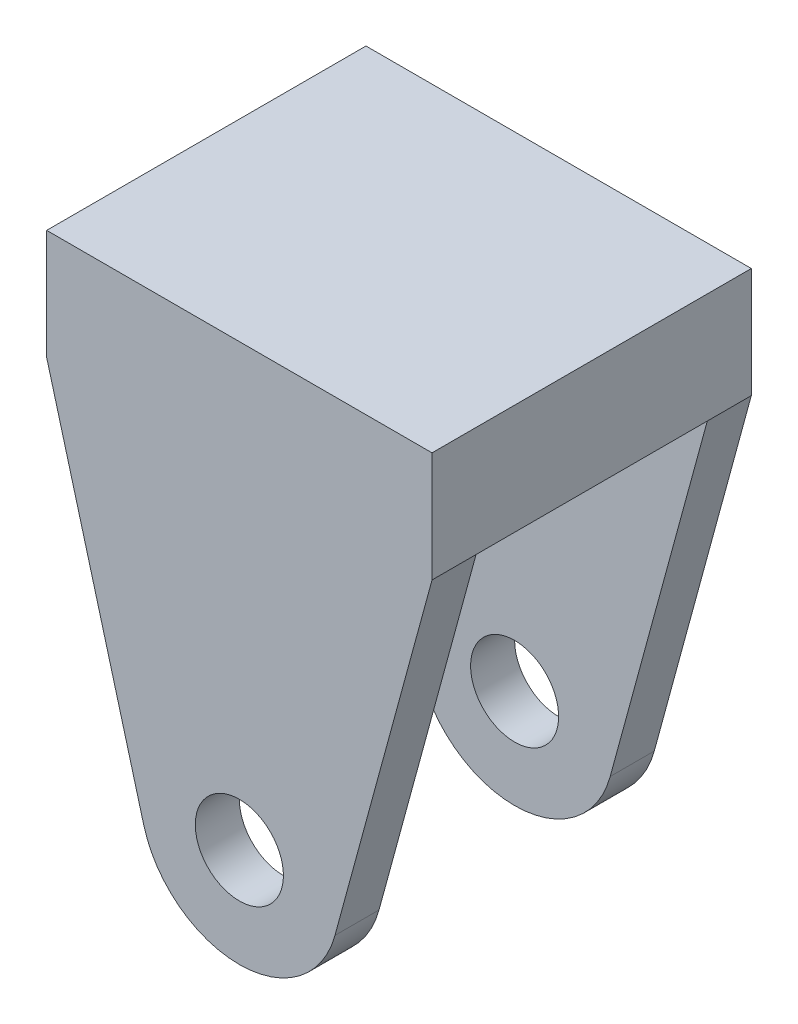
ISO-10303-21;
HEADER;
FILE_DESCRIPTION(('STEP AP214'),'2;1');
FILE_NAME('part.step','',(''),(''),'','','');
FILE_SCHEMA(('AUTOMOTIVE_DESIGN { 1 0 10303 214 1 1 1 1 }'));
ENDSEC;
DATA;
#1=APPLICATION_CONTEXT('core data for automotive mechanical design processes');
#2=APPLICATION_PROTOCOL_DEFINITION('international standard','automotive_design',2000,#1);
#3=PRODUCT_CONTEXT('',#1,'mechanical');
#4=PRODUCT('Part','Part','',(#3));
#5=PRODUCT_RELATED_PRODUCT_CATEGORY('part','',(#4));
#6=PRODUCT_DEFINITION_FORMATION('','',#4);
#7=PRODUCT_DEFINITION_CONTEXT('part definition',#1,'design');
#8=PRODUCT_DEFINITION('design','',#6,#7);
#9=PRODUCT_DEFINITION_SHAPE('','',#8);
#10=(LENGTH_UNIT() NAMED_UNIT(*) SI_UNIT(.MILLI.,.METRE.));
#11=(NAMED_UNIT(*) PLANE_ANGLE_UNIT() SI_UNIT($,.RADIAN.));
#12=(NAMED_UNIT(*) SI_UNIT($,.STERADIAN.) SOLID_ANGLE_UNIT());
#13=UNCERTAINTY_MEASURE_WITH_UNIT(LENGTH_MEASURE(1.E-05),#10,'distance_accuracy_value','');
#14=(GEOMETRIC_REPRESENTATION_CONTEXT(3) GLOBAL_UNCERTAINTY_ASSIGNED_CONTEXT((#13)) GLOBAL_UNIT_ASSIGNED_CONTEXT((#10,
#11,#12)) REPRESENTATION_CONTEXT('',''));
#15=CARTESIAN_POINT('',(0.,0.,0.));
#16=DIRECTION('',(0.,0.,1.));
#17=DIRECTION('',(1.,0.,0.));
#18=AXIS2_PLACEMENT_3D('',#15,#16,#17);
#19=CARTESIAN_POINT('',(-35.,60.,29.));
#20=DIRECTION('',(0.964843815735854,0.262823916788935,0.));
#21=DIRECTION('',(-0.262823916788935,0.964843815735854,0.));
#22=AXIS2_PLACEMENT_3D('',#19,#20,#21);
#23=PLANE('',#22);
#24=DIRECTION('',(0.262823916788935,-0.964843815735854,0.));
#25=VECTOR('',#24,1.);
#26=CARTESIAN_POINT('',(-17.3672837622536,-4.73085640176813,-21.));
#27=LINE('',#26,#25);
#28=CARTESIAN_POINT('',(-35.,60.,-21.));
#29=VERTEX_POINT('',#28);
#30=CARTESIAN_POINT('',(-17.3672837622536,-4.73085640176812,-21.));
#31=VERTEX_POINT('',#30);
#32=EDGE_CURVE('E208',#29,#31,#27,.T.);
#33=ORIENTED_EDGE('',*,*,#32,.F.);
#34=DIRECTION('',(0.,0.,-1.));
#35=VECTOR('',#34,1.);
#36=CARTESIAN_POINT('',(-35.,60.,29.));
#37=LINE('',#36,#35);
#38=CARTESIAN_POINT('',(-35.,60.,-29.));
#39=VERTEX_POINT('',#38);
#40=EDGE_CURVE('E42',#29,#39,#37,.T.);
#41=ORIENTED_EDGE('',*,*,#40,.T.);
#42=DIRECTION('',(0.262823916788935,-0.964843815735854,0.));
#43=VECTOR('',#42,1.);
#44=CARTESIAN_POINT('',(-35.,60.,-29.));
#45=LINE('',#44,#43);
#46=CARTESIAN_POINT('',(-17.3672837622536,-4.73085640176813,-29.));
#47=VERTEX_POINT('',#46);
#48=EDGE_CURVE('E139',#39,#47,#45,.T.);
#49=ORIENTED_EDGE('',*,*,#48,.T.);
#50=DIRECTION('',(0.,0.,-1.));
#51=VECTOR('',#50,1.);
#52=CARTESIAN_POINT('',(-17.3672837622536,-4.73085640176813,29.));
#53=LINE('',#52,#51);
#54=EDGE_CURVE('E157',#31,#47,#53,.T.);
#55=ORIENTED_EDGE('',*,*,#54,.F.);
#56=EDGE_LOOP('',(#33,#41,#49,#55));
#57=FACE_BOUND('',#56,.T.);
#58=ADVANCED_FACE('F33',(#57),#23,.F.);
#59=CARTESIAN_POINT('',(0.,0.,29.));
#60=DIRECTION('',(0.,0.,-1.));
#61=DIRECTION('',(-1.,0.,0.));
#62=AXIS2_PLACEMENT_3D('',#59,#60,#61);
#63=CYLINDRICAL_SURFACE('',#62,18.0000985434188);
#64=CARTESIAN_POINT('',(0.,0.,-21.));
#65=DIRECTION('',(0.,0.,1.));
#66=DIRECTION('',(1.,0.,0.));
#67=AXIS2_PLACEMENT_3D('',#64,#65,#66);
#68=CIRCLE('',#67,18.0000985434188);
#69=CARTESIAN_POINT('',(17.3672837622536,-4.73085640176813,-21.));
#70=VERTEX_POINT('',#69);
#71=EDGE_CURVE('E214',#31,#70,#68,.T.);
#72=ORIENTED_EDGE('',*,*,#71,.F.);
#73=ORIENTED_EDGE('',*,*,#54,.T.);
#74=CARTESIAN_POINT('',(0.,0.,-29.));
#75=DIRECTION('',(0.,0.,1.));
#76=DIRECTION('',(1.,0.,0.));
#77=AXIS2_PLACEMENT_3D('',#74,#75,#76);
#78=CIRCLE('',#77,18.0000985434188);
#79=CARTESIAN_POINT('',(17.3672837622536,-4.73085640176813,-29.));
#80=VERTEX_POINT('',#79);
#81=EDGE_CURVE('E143',#47,#80,#78,.T.);
#82=ORIENTED_EDGE('',*,*,#81,.T.);
#83=DIRECTION('',(0.,0.,-1.));
#84=VECTOR('',#83,1.);
#85=CARTESIAN_POINT('',(17.3672837622536,-4.73085640176813,29.));
#86=LINE('',#85,#84);
#87=EDGE_CURVE('E126',#70,#80,#86,.T.);
#88=ORIENTED_EDGE('',*,*,#87,.F.);
#89=EDGE_LOOP('',(#72,#73,#82,#88));
#90=FACE_BOUND('',#89,.T.);
#91=ADVANCED_FACE('F229',(#90),#63,.T.);
#92=CARTESIAN_POINT('',(35.,60.,29.));
#93=DIRECTION('',(-0.964843815735854,0.262823916788935,0.));
#94=DIRECTION('',(-0.262823916788935,-0.964843815735854,0.));
#95=AXIS2_PLACEMENT_3D('',#92,#93,#94);
#96=PLANE('',#95);
#97=DIRECTION('',(0.262823916788935,0.964843815735854,0.));
#98=VECTOR('',#97,1.);
#99=CARTESIAN_POINT('',(35.,60.,-21.));
#100=LINE('',#99,#98);
#101=CARTESIAN_POINT('',(35.,60.,-21.));
#102=VERTEX_POINT('',#101);
#103=EDGE_CURVE('E219',#70,#102,#100,.T.);
#104=ORIENTED_EDGE('',*,*,#103,.F.);
#105=ORIENTED_EDGE('',*,*,#87,.T.);
#106=DIRECTION('',(0.262823916788935,0.964843815735854,0.));
#107=VECTOR('',#106,1.);
#108=CARTESIAN_POINT('',(35.,60.,-29.));
#109=LINE('',#108,#107);
#110=CARTESIAN_POINT('',(35.,60.,-29.));
#111=VERTEX_POINT('',#110);
#112=EDGE_CURVE('E146',#80,#111,#109,.T.);
#113=ORIENTED_EDGE('',*,*,#112,.T.);
#114=DIRECTION('',(0.,0.,-1.));
#115=VECTOR('',#114,1.);
#116=CARTESIAN_POINT('',(35.,60.,29.));
#117=LINE('',#116,#115);
#118=EDGE_CURVE('E127',#102,#111,#117,.T.);
#119=ORIENTED_EDGE('',*,*,#118,.F.);
#120=EDGE_LOOP('',(#104,#105,#113,#119));
#121=FACE_BOUND('',#120,.T.);
#122=ADVANCED_FACE('F228',(#121),#96,.F.);
#123=CARTESIAN_POINT('',(0.,0.,29.));
#124=DIRECTION('',(0.,0.,-1.));
#125=DIRECTION('',(-1.,0.,0.));
#126=AXIS2_PLACEMENT_3D('',#123,#124,#125);
#127=CYLINDRICAL_SURFACE('',#126,8.);
#128=CARTESIAN_POINT('',(0.,0.,-29.));
#129=DIRECTION('',(0.,0.,1.));
#130=DIRECTION('',(1.,0.,0.));
#131=AXIS2_PLACEMENT_3D('',#128,#129,#130);
#132=CIRCLE('',#131,8.);
#133=CARTESIAN_POINT('',(-8.,0.,-29.));
#134=VERTEX_POINT('',#133);
#135=EDGE_CURVE('E166',#134,#134,#132,.T.);
#136=CARTESIAN_POINT('',(0.,0.,-21.));
#137=DIRECTION('',(0.,0.,1.));
#138=DIRECTION('',(1.,0.,0.));
#139=AXIS2_PLACEMENT_3D('',#136,#137,#138);
#140=CIRCLE('',#139,8.);
#141=CARTESIAN_POINT('',(-8.,0.,-21.));
#142=VERTEX_POINT('',#141);
#143=EDGE_CURVE('E37',#142,#142,#140,.T.);
#144=CARTESIAN_POINT('',(-8.,0.,-29.));
#145=CARTESIAN_POINT('',(-8.,0.,-28.9166666666667));
#146=CARTESIAN_POINT('',(-8.,0.,-28.8333333333333));
#147=CARTESIAN_POINT('',(-8.,0.,-28.6666666666667));
#148=CARTESIAN_POINT('',(-8.,0.,-28.5833333333333));
#149=CARTESIAN_POINT('',(-8.,0.,-28.4166666666667));
#150=CARTESIAN_POINT('',(-8.,0.,-28.3333333333333));
#151=CARTESIAN_POINT('',(-8.,0.,-28.1666666666667));
#152=CARTESIAN_POINT('',(-8.,0.,-28.0833333333333));
#153=CARTESIAN_POINT('',(-8.,0.,-27.9166666666667));
#154=CARTESIAN_POINT('',(-8.,0.,-27.8333333333333));
#155=CARTESIAN_POINT('',(-8.,0.,-27.6666666666667));
#156=CARTESIAN_POINT('',(-8.,0.,-27.5833333333333));
#157=CARTESIAN_POINT('',(-8.,0.,-27.4166666666667));
#158=CARTESIAN_POINT('',(-8.,0.,-27.3333333333333));
#159=CARTESIAN_POINT('',(-8.,0.,-27.1666666666667));
#160=CARTESIAN_POINT('',(-8.,0.,-27.0833333333333));
#161=CARTESIAN_POINT('',(-8.,0.,-26.9166666666667));
#162=CARTESIAN_POINT('',(-8.,0.,-26.8333333333333));
#163=CARTESIAN_POINT('',(-8.,0.,-26.6666666666667));
#164=CARTESIAN_POINT('',(-8.,0.,-26.5833333333333));
#165=CARTESIAN_POINT('',(-8.,0.,-26.4166666666667));
#166=CARTESIAN_POINT('',(-8.,0.,-26.3333333333333));
#167=CARTESIAN_POINT('',(-8.,0.,-26.1666666666667));
#168=CARTESIAN_POINT('',(-8.,0.,-26.0833333333333));
#169=CARTESIAN_POINT('',(-8.,0.,-25.9166666666667));
#170=CARTESIAN_POINT('',(-8.,0.,-25.8333333333333));
#171=CARTESIAN_POINT('',(-8.,0.,-25.6666666666667));
#172=CARTESIAN_POINT('',(-8.,0.,-25.5833333333333));
#173=CARTESIAN_POINT('',(-8.,0.,-25.4166666666667));
#174=CARTESIAN_POINT('',(-8.,0.,-25.3333333333333));
#175=CARTESIAN_POINT('',(-8.,0.,-25.1666666666667));
#176=CARTESIAN_POINT('',(-8.,0.,-25.0833333333333));
#177=CARTESIAN_POINT('',(-8.,0.,-24.9166666666667));
#178=CARTESIAN_POINT('',(-8.,0.,-24.8333333333333));
#179=CARTESIAN_POINT('',(-8.,0.,-24.6666666666667));
#180=CARTESIAN_POINT('',(-8.,0.,-24.5833333333333));
#181=CARTESIAN_POINT('',(-8.,0.,-24.4166666666667));
#182=CARTESIAN_POINT('',(-8.,0.,-24.3333333333333));
#183=CARTESIAN_POINT('',(-8.,0.,-24.1666666666667));
#184=CARTESIAN_POINT('',(-8.,0.,-24.0833333333333));
#185=CARTESIAN_POINT('',(-8.,0.,-23.9166666666667));
#186=CARTESIAN_POINT('',(-8.,0.,-23.8333333333333));
#187=CARTESIAN_POINT('',(-8.,0.,-23.6666666666667));
#188=CARTESIAN_POINT('',(-8.,0.,-23.5833333333333));
#189=CARTESIAN_POINT('',(-8.,0.,-23.4166666666667));
#190=CARTESIAN_POINT('',(-8.,0.,-23.3333333333333));
#191=CARTESIAN_POINT('',(-8.,0.,-23.1666666666667));
#192=CARTESIAN_POINT('',(-8.,0.,-23.0833333333333));
#193=CARTESIAN_POINT('',(-8.,0.,-22.9166666666667));
#194=CARTESIAN_POINT('',(-8.,0.,-22.8333333333333));
#195=CARTESIAN_POINT('',(-8.,0.,-22.6666666666667));
#196=CARTESIAN_POINT('',(-8.,0.,-22.5833333333333));
#197=CARTESIAN_POINT('',(-8.,0.,-22.4166666666667));
#198=CARTESIAN_POINT('',(-8.,0.,-22.3333333333333));
#199=CARTESIAN_POINT('',(-8.,0.,-22.1666666666667));
#200=CARTESIAN_POINT('',(-8.,0.,-22.0833333333333));
#201=CARTESIAN_POINT('',(-8.,0.,-21.9166666666667));
#202=CARTESIAN_POINT('',(-8.,0.,-21.8333333333333));
#203=CARTESIAN_POINT('',(-8.,0.,-21.6666666666667));
#204=CARTESIAN_POINT('',(-8.,0.,-21.5833333333333));
#205=CARTESIAN_POINT('',(-8.,0.,-21.4166666666667));
#206=CARTESIAN_POINT('',(-8.,0.,-21.3333333333333));
#207=CARTESIAN_POINT('',(-8.,0.,-21.1666666666667));
#208=CARTESIAN_POINT('',(-8.,0.,-21.0833333333333));
#209=CARTESIAN_POINT('',(-8.,0.,-21.));
#210=B_SPLINE_CURVE_WITH_KNOTS('',3,(#144,#145,#146,#147,#148,#149,#150,#151,#152,#153,#154,
#155,#156,#157,#158,#159,#160,#161,#162,#163,#164,#165,#166,#167,#168,#169,#170,#171,#172,#173,
#174,#175,#176,#177,#178,#179,#180,#181,#182,#183,#184,#185,#186,#187,#188,#189,#190,#191,#192,
#193,#194,#195,#196,#197,#198,#199,#200,#201,#202,#203,#204,#205,#206,#207,#208,#209),
.UNSPECIFIED.,.F.,.F.,(4,2,2,2,2,2,2,2,2,2,2,2,2,2,2,2,2,2,2,2,2,2,2,2,2,2,2,2,2,2,2,2,4),(0.,
0.25,0.5,0.750000000000001,1.,1.25,1.5,1.75,2.,2.25,2.5,2.75,3.,3.25,3.5,3.75,4.,4.25,4.5,4.75,
5.,5.25,5.5,5.74999999999999,5.99999999999999,6.24999999999999,6.49999999999999,
6.74999999999999,6.99999999999999,7.24999999999999,7.49999999999999,7.74999999999999,
7.99999999999999),.UNSPECIFIED.);
#211=EDGE_CURVE('BSEAM262',#134,#142,#210,.T.);
#212=ORIENTED_EDGE('',*,*,#135,.F.);
#213=ORIENTED_EDGE('',*,*,#143,.T.);
#214=ORIENTED_EDGE('',*,*,#211,.T.);
#215=ORIENTED_EDGE('',*,*,#211,.F.);
#216=EDGE_LOOP('',(#212,#214,#213,#215));
#217=FACE_BOUND('',#216,.T.);
#218=ADVANCED_FACE('F262',(#217),#127,.F.);
#219=CARTESIAN_POINT('',(0.,0.,29.));
#220=DIRECTION('',(0.,0.,1.));
#221=DIRECTION('',(1.,0.,0.));
#222=AXIS2_PLACEMENT_3D('',#219,#220,#221);
#223=PLANE('',#222);
#224=DIRECTION('',(0.,-1.,0.));
#225=VECTOR('',#224,1.);
#226=CARTESIAN_POINT('',(-35.,80.,29.));
#227=LINE('',#226,#225);
#228=CARTESIAN_POINT('',(-35.,80.,29.));
#229=VERTEX_POINT('',#228);
#230=CARTESIAN_POINT('',(-35.,60.,29.));
#231=VERTEX_POINT('',#230);
#232=EDGE_CURVE('E152',#229,#231,#227,.T.);
#233=ORIENTED_EDGE('',*,*,#232,.T.);
#234=DIRECTION('',(0.262823916788935,-0.964843815735854,0.));
#235=VECTOR('',#234,1.);
#236=CARTESIAN_POINT('',(-35.,60.,29.));
#237=LINE('',#236,#235);
#238=CARTESIAN_POINT('',(-17.3672837622536,-4.73085640176813,29.));
#239=VERTEX_POINT('',#238);
#240=EDGE_CURVE('E94',#231,#239,#237,.T.);
#241=ORIENTED_EDGE('',*,*,#240,.T.);
#242=CARTESIAN_POINT('',(0.,0.,29.));
#243=DIRECTION('',(0.,0.,1.));
#244=DIRECTION('',(1.,0.,0.));
#245=AXIS2_PLACEMENT_3D('',#242,#243,#244);
#246=CIRCLE('',#245,18.0000985434188);
#247=CARTESIAN_POINT('',(17.3672837622536,-4.73085640176813,29.));
#248=VERTEX_POINT('',#247);
#249=EDGE_CURVE('E112',#239,#248,#246,.T.);
#250=ORIENTED_EDGE('',*,*,#249,.T.);
#251=DIRECTION('',(0.262823916788935,0.964843815735854,0.));
#252=VECTOR('',#251,1.);
#253=CARTESIAN_POINT('',(35.,60.,29.));
#254=LINE('',#253,#252);
#255=CARTESIAN_POINT('',(35.,60.,29.));
#256=VERTEX_POINT('',#255);
#257=EDGE_CURVE('E104',#248,#256,#254,.T.);
#258=ORIENTED_EDGE('',*,*,#257,.T.);
#259=DIRECTION('',(0.,1.,0.));
#260=VECTOR('',#259,1.);
#261=CARTESIAN_POINT('',(35.,60.,29.));
#262=LINE('',#261,#260);
#263=CARTESIAN_POINT('',(35.,80.,29.));
#264=VERTEX_POINT('',#263);
#265=EDGE_CURVE('E109',#256,#264,#262,.T.);
#266=ORIENTED_EDGE('',*,*,#265,.T.);
#267=DIRECTION('',(-1.,0.,0.));
#268=VECTOR('',#267,1.);
#269=CARTESIAN_POINT('',(35.,80.,29.));
#270=LINE('',#269,#268);
#271=EDGE_CURVE('E59',#264,#229,#270,.T.);
#272=ORIENTED_EDGE('',*,*,#271,.T.);
#273=EDGE_LOOP('',(#233,#241,#250,#258,#266,#272));
#274=FACE_BOUND('',#273,.T.);
#275=CARTESIAN_POINT('',(0.,0.,29.));
#276=DIRECTION('',(0.,0.,1.));
#277=DIRECTION('',(1.,0.,0.));
#278=AXIS2_PLACEMENT_3D('',#275,#276,#277);
#279=CIRCLE('',#278,8.);
#280=CARTESIAN_POINT('',(-8.,0.,29.));
#281=VERTEX_POINT('',#280);
#282=EDGE_CURVE('E140',#281,#281,#279,.T.);
#283=ORIENTED_EDGE('',*,*,#282,.F.);
#284=EDGE_LOOP('',(#283));
#285=FACE_BOUND('',#284,.T.);
#286=ADVANCED_FACE('F106',(#274,#285),#223,.T.);
#287=CARTESIAN_POINT('',(0.,0.,-29.));
#288=DIRECTION('',(0.,0.,1.));
#289=DIRECTION('',(1.,0.,0.));
#290=AXIS2_PLACEMENT_3D('',#287,#288,#289);
#291=PLANE('',#290);
#292=DIRECTION('',(0.,-1.,0.));
#293=VECTOR('',#292,1.);
#294=CARTESIAN_POINT('',(-35.,80.,-29.));
#295=LINE('',#294,#293);
#296=CARTESIAN_POINT('',(-35.,80.,-29.));
#297=VERTEX_POINT('',#296);
#298=EDGE_CURVE('E136',#297,#39,#295,.T.);
#299=ORIENTED_EDGE('',*,*,#298,.F.);
#300=DIRECTION('',(-1.,0.,0.));
#301=VECTOR('',#300,1.);
#302=CARTESIAN_POINT('',(35.,80.,-29.));
#303=LINE('',#302,#301);
#304=CARTESIAN_POINT('',(35.,80.,-29.));
#305=VERTEX_POINT('',#304);
#306=EDGE_CURVE('E86',#305,#297,#303,.T.);
#307=ORIENTED_EDGE('',*,*,#306,.F.);
#308=DIRECTION('',(0.,1.,0.));
#309=VECTOR('',#308,1.);
#310=CARTESIAN_POINT('',(35.,60.,-29.));
#311=LINE('',#310,#309);
#312=EDGE_CURVE('E149',#111,#305,#311,.T.);
#313=ORIENTED_EDGE('',*,*,#312,.F.);
#314=ORIENTED_EDGE('',*,*,#112,.F.);
#315=ORIENTED_EDGE('',*,*,#81,.F.);
#316=ORIENTED_EDGE('',*,*,#48,.F.);
#317=EDGE_LOOP('',(#299,#307,#313,#314,#315,#316));
#318=FACE_BOUND('',#317,.T.);
#319=ORIENTED_EDGE('',*,*,#135,.T.);
#320=EDGE_LOOP('',(#319));
#321=FACE_BOUND('',#320,.T.);
#322=ADVANCED_FACE('F236',(#318,#321),#291,.F.);
#323=CARTESIAN_POINT('',(-35.,80.,29.));
#324=DIRECTION('',(1.,0.,0.));
#325=DIRECTION('',(0.,0.,-1.));
#326=AXIS2_PLACEMENT_3D('',#323,#324,#325);
#327=PLANE('',#326);
#328=ORIENTED_EDGE('',*,*,#298,.T.);
#329=ORIENTED_EDGE('',*,*,#40,.F.);
#330=DIRECTION('',(0.,0.,1.));
#331=VECTOR('',#330,1.);
#332=CARTESIAN_POINT('',(-35.,60.,-21.));
#333=LINE('',#332,#331);
#334=CARTESIAN_POINT('',(-35.,60.,21.));
#335=VERTEX_POINT('',#334);
#336=EDGE_CURVE('E162',#29,#335,#333,.T.);
#337=ORIENTED_EDGE('',*,*,#336,.T.);
#338=EDGE_CURVE('E11',#231,#335,#37,.T.);
#339=ORIENTED_EDGE('',*,*,#338,.F.);
#340=ORIENTED_EDGE('',*,*,#232,.F.);
#341=DIRECTION('',(0.,0.,-1.));
#342=VECTOR('',#341,1.);
#343=CARTESIAN_POINT('',(-35.,80.,29.));
#344=LINE('',#343,#342);
#345=EDGE_CURVE('E132',#229,#297,#344,.T.);
#346=ORIENTED_EDGE('',*,*,#345,.T.);
#347=EDGE_LOOP('',(#328,#329,#337,#339,#340,#346));
#348=FACE_BOUND('',#347,.T.);
#349=ADVANCED_FACE('F35',(#348),#327,.F.);
#350=ORIENTED_EDGE('',*,*,#338,.T.);
#351=DIRECTION('',(0.262823916788935,-0.964843815735854,0.));
#352=VECTOR('',#351,1.);
#353=CARTESIAN_POINT('',(-17.3672837622536,-4.73085640176813,21.));
#354=LINE('',#353,#352);
#355=CARTESIAN_POINT('',(-17.3672837622536,-4.73085640176812,21.));
#356=VERTEX_POINT('',#355);
#357=EDGE_CURVE('E188',#335,#356,#354,.T.);
#358=ORIENTED_EDGE('',*,*,#357,.T.);
#359=EDGE_CURVE('E158',#239,#356,#53,.T.);
#360=ORIENTED_EDGE('',*,*,#359,.F.);
#361=ORIENTED_EDGE('',*,*,#240,.F.);
#362=EDGE_LOOP('',(#350,#358,#360,#361));
#363=FACE_BOUND('',#362,.T.);
#364=ADVANCED_FACE('F185',(#363),#23,.F.);
#365=ORIENTED_EDGE('',*,*,#359,.T.);
#366=CARTESIAN_POINT('',(0.,0.,21.));
#367=DIRECTION('',(0.,0.,1.));
#368=DIRECTION('',(1.,0.,0.));
#369=AXIS2_PLACEMENT_3D('',#366,#367,#368);
#370=CIRCLE('',#369,18.0000985434188);
#371=CARTESIAN_POINT('',(17.3672837622536,-4.73085640176813,21.));
#372=VERTEX_POINT('',#371);
#373=EDGE_CURVE('E194',#356,#372,#370,.T.);
#374=ORIENTED_EDGE('',*,*,#373,.T.);
#375=EDGE_CURVE('E155',#248,#372,#86,.T.);
#376=ORIENTED_EDGE('',*,*,#375,.F.);
#377=ORIENTED_EDGE('',*,*,#249,.F.);
#378=EDGE_LOOP('',(#365,#374,#376,#377));
#379=FACE_BOUND('',#378,.T.);
#380=ADVANCED_FACE('F191',(#379),#63,.T.);
#381=ORIENTED_EDGE('',*,*,#375,.T.);
#382=DIRECTION('',(0.262823916788935,0.964843815735854,0.));
#383=VECTOR('',#382,1.);
#384=CARTESIAN_POINT('',(35.,60.,21.));
#385=LINE('',#384,#383);
#386=CARTESIAN_POINT('',(35.,60.,21.));
#387=VERTEX_POINT('',#386);
#388=EDGE_CURVE('E123',#372,#387,#385,.T.);
#389=ORIENTED_EDGE('',*,*,#388,.T.);
#390=EDGE_CURVE('E119',#256,#387,#117,.T.);
#391=ORIENTED_EDGE('',*,*,#390,.F.);
#392=ORIENTED_EDGE('',*,*,#257,.F.);
#393=EDGE_LOOP('',(#381,#389,#391,#392));
#394=FACE_BOUND('',#393,.T.);
#395=ADVANCED_FACE('F120',(#394),#96,.F.);
#396=CARTESIAN_POINT('',(35.,60.,29.));
#397=DIRECTION('',(-1.,0.,0.));
#398=DIRECTION('',(0.,0.,1.));
#399=AXIS2_PLACEMENT_3D('',#396,#397,#398);
#400=PLANE('',#399);
#401=ORIENTED_EDGE('',*,*,#312,.T.);
#402=DIRECTION('',(0.,0.,-1.));
#403=VECTOR('',#402,1.);
#404=CARTESIAN_POINT('',(35.,80.,29.));
#405=LINE('',#404,#403);
#406=EDGE_CURVE('E130',#264,#305,#405,.T.);
#407=ORIENTED_EDGE('',*,*,#406,.F.);
#408=ORIENTED_EDGE('',*,*,#265,.F.);
#409=ORIENTED_EDGE('',*,*,#390,.T.);
#410=DIRECTION('',(0.,0.,1.));
#411=VECTOR('',#410,1.);
#412=CARTESIAN_POINT('',(35.,60.,-21.));
#413=LINE('',#412,#411);
#414=EDGE_CURVE('E168',#102,#387,#413,.T.);
#415=ORIENTED_EDGE('',*,*,#414,.F.);
#416=ORIENTED_EDGE('',*,*,#118,.T.);
#417=EDGE_LOOP('',(#401,#407,#408,#409,#415,#416));
#418=FACE_BOUND('',#417,.T.);
#419=ADVANCED_FACE('F129',(#418),#400,.F.);
#420=CARTESIAN_POINT('',(35.,80.,29.));
#421=DIRECTION('',(0.,-1.,0.));
#422=DIRECTION('',(0.,0.,-1.));
#423=AXIS2_PLACEMENT_3D('',#420,#421,#422);
#424=PLANE('',#423);
#425=ORIENTED_EDGE('',*,*,#306,.T.);
#426=ORIENTED_EDGE('',*,*,#345,.F.);
#427=ORIENTED_EDGE('',*,*,#271,.F.);
#428=ORIENTED_EDGE('',*,*,#406,.T.);
#429=EDGE_LOOP('',(#425,#426,#427,#428));
#430=FACE_BOUND('',#429,.T.);
#431=ADVANCED_FACE('F238',(#430),#424,.F.);
#432=CARTESIAN_POINT('',(0.,0.,21.));
#433=DIRECTION('',(0.,0.,1.));
#434=DIRECTION('',(1.,0.,0.));
#435=AXIS2_PLACEMENT_3D('',#432,#433,#434);
#436=CIRCLE('',#435,8.);
#437=CARTESIAN_POINT('',(-8.,0.,21.));
#438=VERTEX_POINT('',#437);
#439=EDGE_CURVE('E160',#438,#438,#436,.T.);
#440=CARTESIAN_POINT('',(-8.,0.,21.));
#441=CARTESIAN_POINT('',(-8.,0.,21.0833333333333));
#442=CARTESIAN_POINT('',(-8.,0.,21.1666666666667));
#443=CARTESIAN_POINT('',(-8.,0.,21.3333333333333));
#444=CARTESIAN_POINT('',(-8.,0.,21.4166666666667));
#445=CARTESIAN_POINT('',(-8.,0.,21.5833333333333));
#446=CARTESIAN_POINT('',(-8.,0.,21.6666666666667));
#447=CARTESIAN_POINT('',(-8.,0.,21.8333333333333));
#448=CARTESIAN_POINT('',(-8.,0.,21.9166666666667));
#449=CARTESIAN_POINT('',(-8.,0.,22.0833333333333));
#450=CARTESIAN_POINT('',(-8.,0.,22.1666666666667));
#451=CARTESIAN_POINT('',(-8.,0.,22.3333333333333));
#452=CARTESIAN_POINT('',(-8.,0.,22.4166666666667));
#453=CARTESIAN_POINT('',(-8.,0.,22.5833333333333));
#454=CARTESIAN_POINT('',(-8.,0.,22.6666666666667));
#455=CARTESIAN_POINT('',(-8.,0.,22.8333333333333));
#456=CARTESIAN_POINT('',(-8.,0.,22.9166666666667));
#457=CARTESIAN_POINT('',(-8.,0.,23.0833333333333));
#458=CARTESIAN_POINT('',(-8.,0.,23.1666666666667));
#459=CARTESIAN_POINT('',(-8.,0.,23.3333333333333));
#460=CARTESIAN_POINT('',(-8.,0.,23.4166666666667));
#461=CARTESIAN_POINT('',(-8.,0.,23.5833333333333));
#462=CARTESIAN_POINT('',(-8.,0.,23.6666666666667));
#463=CARTESIAN_POINT('',(-8.,0.,23.8333333333333));
#464=CARTESIAN_POINT('',(-8.,0.,23.9166666666667));
#465=CARTESIAN_POINT('',(-8.,0.,24.0833333333333));
#466=CARTESIAN_POINT('',(-8.,0.,24.1666666666667));
#467=CARTESIAN_POINT('',(-8.,0.,24.3333333333333));
#468=CARTESIAN_POINT('',(-8.,0.,24.4166666666667));
#469=CARTESIAN_POINT('',(-8.,0.,24.5833333333333));
#470=CARTESIAN_POINT('',(-8.,0.,24.6666666666667));
#471=CARTESIAN_POINT('',(-8.,0.,24.8333333333333));
#472=CARTESIAN_POINT('',(-8.,0.,24.9166666666667));
#473=CARTESIAN_POINT('',(-8.,0.,25.0833333333333));
#474=CARTESIAN_POINT('',(-8.,0.,25.1666666666667));
#475=CARTESIAN_POINT('',(-8.,0.,25.3333333333333));
#476=CARTESIAN_POINT('',(-8.,0.,25.4166666666667));
#477=CARTESIAN_POINT('',(-8.,0.,25.5833333333333));
#478=CARTESIAN_POINT('',(-8.,0.,25.6666666666667));
#479=CARTESIAN_POINT('',(-8.,0.,25.8333333333333));
#480=CARTESIAN_POINT('',(-8.,0.,25.9166666666667));
#481=CARTESIAN_POINT('',(-8.,0.,26.0833333333333));
#482=CARTESIAN_POINT('',(-8.,0.,26.1666666666667));
#483=CARTESIAN_POINT('',(-8.,0.,26.3333333333333));
#484=CARTESIAN_POINT('',(-8.,0.,26.4166666666667));
#485=CARTESIAN_POINT('',(-8.,0.,26.5833333333333));
#486=CARTESIAN_POINT('',(-8.,0.,26.6666666666667));
#487=CARTESIAN_POINT('',(-8.,0.,26.8333333333333));
#488=CARTESIAN_POINT('',(-8.,0.,26.9166666666667));
#489=CARTESIAN_POINT('',(-8.,0.,27.0833333333333));
#490=CARTESIAN_POINT('',(-8.,0.,27.1666666666667));
#491=CARTESIAN_POINT('',(-8.,0.,27.3333333333333));
#492=CARTESIAN_POINT('',(-8.,0.,27.4166666666667));
#493=CARTESIAN_POINT('',(-8.,0.,27.5833333333333));
#494=CARTESIAN_POINT('',(-8.,0.,27.6666666666667));
#495=CARTESIAN_POINT('',(-8.,0.,27.8333333333333));
#496=CARTESIAN_POINT('',(-8.,0.,27.9166666666667));
#497=CARTESIAN_POINT('',(-8.,0.,28.0833333333333));
#498=CARTESIAN_POINT('',(-8.,0.,28.1666666666667));
#499=CARTESIAN_POINT('',(-8.,0.,28.3333333333333));
#500=CARTESIAN_POINT('',(-8.,0.,28.4166666666667));
#501=CARTESIAN_POINT('',(-8.,0.,28.5833333333333));
#502=CARTESIAN_POINT('',(-8.,0.,28.6666666666667));
#503=CARTESIAN_POINT('',(-8.,0.,28.8333333333333));
#504=CARTESIAN_POINT('',(-8.,0.,28.9166666666667));
#505=CARTESIAN_POINT('',(-8.,0.,29.));
#506=B_SPLINE_CURVE_WITH_KNOTS('',3,(#440,#441,#442,#443,#444,#445,#446,#447,#448,#449,#450,
#451,#452,#453,#454,#455,#456,#457,#458,#459,#460,#461,#462,#463,#464,#465,#466,#467,#468,#469,
#470,#471,#472,#473,#474,#475,#476,#477,#478,#479,#480,#481,#482,#483,#484,#485,#486,#487,#488,
#489,#490,#491,#492,#493,#494,#495,#496,#497,#498,#499,#500,#501,#502,#503,#504,#505),
.UNSPECIFIED.,.F.,.F.,(4,2,2,2,2,2,2,2,2,2,2,2,2,2,2,2,2,2,2,2,2,2,2,2,2,2,2,2,2,2,2,2,4),(0.,
0.25,0.5,0.750000000000001,1.,1.25,1.5,1.75,2.,2.25,2.5,2.75,3.,3.25,3.5,3.75,4.,4.25,4.5,4.75,
5.,5.25,5.5,5.75,6.,6.25,6.5,6.75,7.,7.25,7.5,7.75,8.),.UNSPECIFIED.);
#507=EDGE_CURVE('BSEAM258',#438,#281,#506,.T.);
#508=ORIENTED_EDGE('',*,*,#439,.F.);
#509=ORIENTED_EDGE('',*,*,#282,.T.);
#510=ORIENTED_EDGE('',*,*,#507,.T.);
#511=ORIENTED_EDGE('',*,*,#507,.F.);
#512=EDGE_LOOP('',(#508,#510,#509,#511));
#513=FACE_BOUND('',#512,.T.);
#514=ADVANCED_FACE('F258',(#513),#127,.F.);
#515=CARTESIAN_POINT('',(-35.,60.,-21.));
#516=DIRECTION('',(0.,1.,0.));
#517=DIRECTION('',(0.,0.,1.));
#518=AXIS2_PLACEMENT_3D('',#515,#516,#517);
#519=PLANE('',#518);
#520=DIRECTION('',(-1.,0.,0.));
#521=VECTOR('',#520,1.);
#522=CARTESIAN_POINT('',(-35.,60.,21.));
#523=LINE('',#522,#521);
#524=EDGE_CURVE('E175',#387,#335,#523,.T.);
#525=ORIENTED_EDGE('',*,*,#524,.T.);
#526=ORIENTED_EDGE('',*,*,#336,.F.);
#527=DIRECTION('',(-1.,0.,0.));
#528=VECTOR('',#527,1.);
#529=CARTESIAN_POINT('',(-35.,60.,-21.));
#530=LINE('',#529,#528);
#531=EDGE_CURVE('E50',#102,#29,#530,.T.);
#532=ORIENTED_EDGE('',*,*,#531,.F.);
#533=ORIENTED_EDGE('',*,*,#414,.T.);
#534=EDGE_LOOP('',(#525,#526,#532,#533));
#535=FACE_BOUND('',#534,.T.);
#536=ADVANCED_FACE('F213',(#535),#519,.F.);
#537=CARTESIAN_POINT('',(0.,0.,-21.));
#538=DIRECTION('',(0.,0.,1.));
#539=DIRECTION('',(1.,0.,0.));
#540=AXIS2_PLACEMENT_3D('',#537,#538,#539);
#541=PLANE('',#540);
#542=ORIENTED_EDGE('',*,*,#143,.F.);
#543=EDGE_LOOP('',(#542));
#544=FACE_BOUND('',#543,.T.);
#545=ORIENTED_EDGE('',*,*,#32,.T.);
#546=ORIENTED_EDGE('',*,*,#71,.T.);
#547=ORIENTED_EDGE('',*,*,#103,.T.);
#548=ORIENTED_EDGE('',*,*,#531,.T.);
#549=EDGE_LOOP('',(#545,#546,#547,#548));
#550=FACE_BOUND('',#549,.T.);
#551=ADVANCED_FACE('F222',(#544,#550),#541,.T.);
#552=CARTESIAN_POINT('',(0.,0.,21.));
#553=DIRECTION('',(0.,0.,1.));
#554=DIRECTION('',(1.,0.,0.));
#555=AXIS2_PLACEMENT_3D('',#552,#553,#554);
#556=PLANE('',#555);
#557=ORIENTED_EDGE('',*,*,#439,.T.);
#558=EDGE_LOOP('',(#557));
#559=FACE_BOUND('',#558,.T.);
#560=ORIENTED_EDGE('',*,*,#357,.F.);
#561=ORIENTED_EDGE('',*,*,#524,.F.);
#562=ORIENTED_EDGE('',*,*,#388,.F.);
#563=ORIENTED_EDGE('',*,*,#373,.F.);
#564=EDGE_LOOP('',(#560,#561,#562,#563));
#565=FACE_BOUND('',#564,.T.);
#566=ADVANCED_FACE('F211',(#559,#565),#556,.F.);
#567=CLOSED_SHELL('',(#58,#91,#122,#218,#286,#322,#349,#364,#380,#395,#419,#431,#514,#536,#551,#566));
#568=MANIFOLD_SOLID_BREP('B2',#567);
#569=ADVANCED_BREP_SHAPE_REPRESENTATION('',(#18,#568),#14);
#570=SHAPE_DEFINITION_REPRESENTATION(#9,#569);
ENDSEC;
END-ISO-10303-21;
